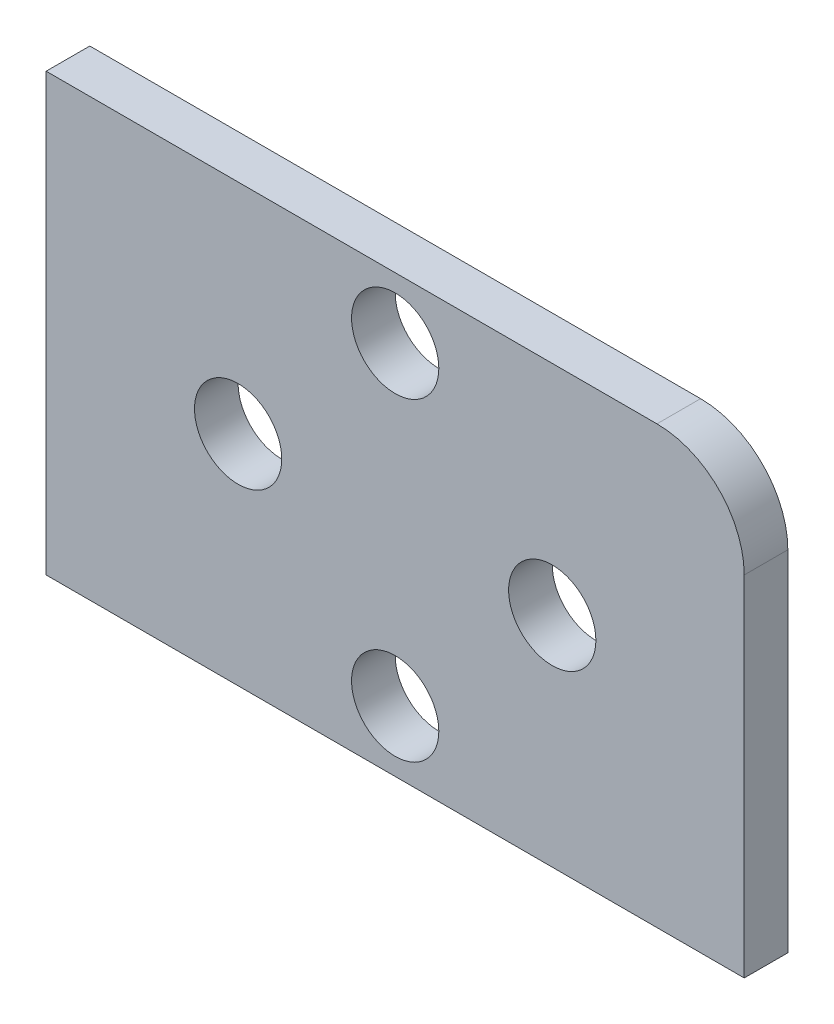
ISO-10303-21;
HEADER;
FILE_DESCRIPTION(('STEP AP214'),'2;1');
FILE_NAME('part.step','',(''),(''),'','','');
FILE_SCHEMA(('AUTOMOTIVE_DESIGN { 1 0 10303 214 1 1 1 1 }'));
ENDSEC;
DATA;
#1=APPLICATION_CONTEXT('core data for automotive mechanical design processes');
#2=APPLICATION_PROTOCOL_DEFINITION('international standard','automotive_design',2000,#1);
#3=PRODUCT_CONTEXT('',#1,'mechanical');
#4=PRODUCT('Part','Part','',(#3));
#5=PRODUCT_RELATED_PRODUCT_CATEGORY('part','',(#4));
#6=PRODUCT_DEFINITION_FORMATION('','',#4);
#7=PRODUCT_DEFINITION_CONTEXT('part definition',#1,'design');
#8=PRODUCT_DEFINITION('design','',#6,#7);
#9=PRODUCT_DEFINITION_SHAPE('','',#8);
#10=(LENGTH_UNIT() NAMED_UNIT(*) SI_UNIT(.MILLI.,.METRE.));
#11=(NAMED_UNIT(*) PLANE_ANGLE_UNIT() SI_UNIT($,.RADIAN.));
#12=(NAMED_UNIT(*) SI_UNIT($,.STERADIAN.) SOLID_ANGLE_UNIT());
#13=UNCERTAINTY_MEASURE_WITH_UNIT(LENGTH_MEASURE(1.E-05),#10,'distance_accuracy_value','');
#14=(GEOMETRIC_REPRESENTATION_CONTEXT(3) GLOBAL_UNCERTAINTY_ASSIGNED_CONTEXT((#13)) GLOBAL_UNIT_ASSIGNED_CONTEXT((#10,
#11,#12)) REPRESENTATION_CONTEXT('',''));
#15=CARTESIAN_POINT('',(0.,0.,0.));
#16=DIRECTION('',(0.,0.,1.));
#17=DIRECTION('',(1.,0.,0.));
#18=AXIS2_PLACEMENT_3D('',#15,#16,#17);
#19=CARTESIAN_POINT('',(30.,15.,-5.));
#20=DIRECTION('',(0.,0.,1.));
#21=DIRECTION('',(1.,0.,0.));
#22=AXIS2_PLACEMENT_3D('',#19,#20,#21);
#23=CYLINDRICAL_SURFACE('',#22,10.);
#24=DIRECTION('',(0.,0.,-1.));
#25=VECTOR('',#24,1.);
#26=CARTESIAN_POINT('',(30.,25.,-5.));
#27=LINE('',#26,#25);
#28=CARTESIAN_POINT('',(30.,25.,0.));
#29=VERTEX_POINT('',#28);
#30=CARTESIAN_POINT('',(30.,25.,-5.));
#31=VERTEX_POINT('',#30);
#32=EDGE_CURVE('E88',#29,#31,#27,.T.);
#33=ORIENTED_EDGE('',*,*,#32,.F.);
#34=CARTESIAN_POINT('',(30.,15.,0.));
#35=DIRECTION('',(0.,0.,1.));
#36=DIRECTION('',(1.,0.,0.));
#37=AXIS2_PLACEMENT_3D('',#34,#35,#36);
#38=CIRCLE('',#37,10.);
#39=CARTESIAN_POINT('',(40.,15.,0.));
#40=VERTEX_POINT('',#39);
#41=EDGE_CURVE('E46',#40,#29,#38,.T.);
#42=ORIENTED_EDGE('',*,*,#41,.F.);
#43=DIRECTION('',(0.,0.,-1.));
#44=VECTOR('',#43,1.);
#45=CARTESIAN_POINT('',(40.,15.,-5.));
#46=LINE('',#45,#44);
#47=CARTESIAN_POINT('',(40.,15.,-5.));
#48=VERTEX_POINT('',#47);
#49=EDGE_CURVE('E135',#48,#40,#46,.F.);
#50=ORIENTED_EDGE('',*,*,#49,.F.);
#51=CARTESIAN_POINT('',(30.,15.,-5.));
#52=DIRECTION('',(0.,0.,1.));
#53=DIRECTION('',(1.,0.,0.));
#54=AXIS2_PLACEMENT_3D('',#51,#52,#53);
#55=CIRCLE('',#54,10.);
#56=EDGE_CURVE('E11',#31,#48,#55,.F.);
#57=ORIENTED_EDGE('',*,*,#56,.F.);
#58=EDGE_LOOP('',(#33,#42,#50,#57));
#59=FACE_BOUND('',#58,.T.);
#60=ADVANCED_FACE('F38',(#59),#23,.T.);
#61=CARTESIAN_POINT('',(40.,25.,-5.));
#62=DIRECTION('',(0.,1.,0.));
#63=DIRECTION('',(-1.,0.,0.));
#64=AXIS2_PLACEMENT_3D('',#61,#62,#63);
#65=PLANE('',#64);
#66=DIRECTION('',(-1.,0.,0.));
#67=VECTOR('',#66,1.);
#68=CARTESIAN_POINT('',(40.,25.,0.));
#69=LINE('',#68,#67);
#70=CARTESIAN_POINT('',(-40.,25.,0.));
#71=VERTEX_POINT('',#70);
#72=EDGE_CURVE('E115',#29,#71,#69,.T.);
#73=ORIENTED_EDGE('',*,*,#72,.F.);
#74=ORIENTED_EDGE('',*,*,#32,.T.);
#75=DIRECTION('',(-1.,0.,0.));
#76=VECTOR('',#75,1.);
#77=CARTESIAN_POINT('',(40.,25.,-5.));
#78=LINE('',#77,#76);
#79=CARTESIAN_POINT('',(-40.,25.,-5.));
#80=VERTEX_POINT('',#79);
#81=EDGE_CURVE('E82',#31,#80,#78,.T.);
#82=ORIENTED_EDGE('',*,*,#81,.T.);
#83=DIRECTION('',(0.,0.,1.));
#84=VECTOR('',#83,1.);
#85=CARTESIAN_POINT('',(-40.,25.,-5.));
#86=LINE('',#85,#84);
#87=EDGE_CURVE('E86',#80,#71,#86,.T.);
#88=ORIENTED_EDGE('',*,*,#87,.T.);
#89=EDGE_LOOP('',(#73,#74,#82,#88));
#90=FACE_BOUND('',#89,.T.);
#91=ADVANCED_FACE('F85',(#90),#65,.T.);
#92=CARTESIAN_POINT('',(40.,25.,-5.));
#93=DIRECTION('',(-1.,0.,0.));
#94=DIRECTION('',(0.,-1.,0.));
#95=AXIS2_PLACEMENT_3D('',#92,#93,#94);
#96=PLANE('',#95);
#97=DIRECTION('',(0.,-1.,0.));
#98=VECTOR('',#97,1.);
#99=CARTESIAN_POINT('',(40.,25.,-5.));
#100=LINE('',#99,#98);
#101=CARTESIAN_POINT('',(40.,-25.,-5.));
#102=VERTEX_POINT('',#101);
#103=EDGE_CURVE('E101',#48,#102,#100,.T.);
#104=ORIENTED_EDGE('',*,*,#103,.F.);
#105=ORIENTED_EDGE('',*,*,#49,.T.);
#106=DIRECTION('',(0.,-1.,0.));
#107=VECTOR('',#106,1.);
#108=CARTESIAN_POINT('',(40.,25.,0.));
#109=LINE('',#108,#107);
#110=CARTESIAN_POINT('',(40.,-25.,0.));
#111=VERTEX_POINT('',#110);
#112=EDGE_CURVE('E92',#40,#111,#109,.T.);
#113=ORIENTED_EDGE('',*,*,#112,.T.);
#114=DIRECTION('',(0.,0.,1.));
#115=VECTOR('',#114,1.);
#116=CARTESIAN_POINT('',(40.,-25.,-5.));
#117=LINE('',#116,#115);
#118=EDGE_CURVE('E127',#102,#111,#117,.T.);
#119=ORIENTED_EDGE('',*,*,#118,.F.);
#120=EDGE_LOOP('',(#104,#105,#113,#119));
#121=FACE_BOUND('',#120,.T.);
#122=ADVANCED_FACE('F145',(#121),#96,.F.);
#123=CARTESIAN_POINT('',(40.,-25.,-5.));
#124=DIRECTION('',(0.,1.,0.));
#125=DIRECTION('',(-1.,0.,0.));
#126=AXIS2_PLACEMENT_3D('',#123,#124,#125);
#127=PLANE('',#126);
#128=DIRECTION('',(-1.,0.,0.));
#129=VECTOR('',#128,1.);
#130=CARTESIAN_POINT('',(40.,-25.,0.));
#131=LINE('',#130,#129);
#132=CARTESIAN_POINT('',(-40.,-25.,0.));
#133=VERTEX_POINT('',#132);
#134=EDGE_CURVE('E121',#111,#133,#131,.T.);
#135=ORIENTED_EDGE('',*,*,#134,.T.);
#136=DIRECTION('',(0.,0.,1.));
#137=VECTOR('',#136,1.);
#138=CARTESIAN_POINT('',(-40.,-25.,-5.));
#139=LINE('',#138,#137);
#140=CARTESIAN_POINT('',(-40.,-25.,-5.));
#141=VERTEX_POINT('',#140);
#142=EDGE_CURVE('E100',#141,#133,#139,.T.);
#143=ORIENTED_EDGE('',*,*,#142,.F.);
#144=DIRECTION('',(-1.,0.,0.));
#145=VECTOR('',#144,1.);
#146=CARTESIAN_POINT('',(40.,-25.,-5.));
#147=LINE('',#146,#145);
#148=EDGE_CURVE('E105',#102,#141,#147,.T.);
#149=ORIENTED_EDGE('',*,*,#148,.F.);
#150=ORIENTED_EDGE('',*,*,#118,.T.);
#151=EDGE_LOOP('',(#135,#143,#149,#150));
#152=FACE_BOUND('',#151,.T.);
#153=ADVANCED_FACE('F147',(#152),#127,.F.);
#154=CARTESIAN_POINT('',(-40.,25.,-5.));
#155=DIRECTION('',(-1.,0.,0.));
#156=DIRECTION('',(0.,-1.,0.));
#157=AXIS2_PLACEMENT_3D('',#154,#155,#156);
#158=PLANE('',#157);
#159=DIRECTION('',(0.,-1.,0.));
#160=VECTOR('',#159,1.);
#161=CARTESIAN_POINT('',(-40.,25.,0.));
#162=LINE('',#161,#160);
#163=EDGE_CURVE('E98',#71,#133,#162,.T.);
#164=ORIENTED_EDGE('',*,*,#163,.F.);
#165=ORIENTED_EDGE('',*,*,#87,.F.);
#166=DIRECTION('',(0.,-1.,0.));
#167=VECTOR('',#166,1.);
#168=CARTESIAN_POINT('',(-40.,25.,-5.));
#169=LINE('',#168,#167);
#170=EDGE_CURVE('E91',#80,#141,#169,.T.);
#171=ORIENTED_EDGE('',*,*,#170,.T.);
#172=ORIENTED_EDGE('',*,*,#142,.T.);
#173=EDGE_LOOP('',(#164,#165,#171,#172));
#174=FACE_BOUND('',#173,.T.);
#175=ADVANCED_FACE('F96',(#174),#158,.T.);
#176=CARTESIAN_POINT('',(0.,0.,-5.));
#177=DIRECTION('',(0.,0.,1.));
#178=DIRECTION('',(1.,0.,0.));
#179=AXIS2_PLACEMENT_3D('',#176,#177,#178);
#180=PLANE('',#179);
#181=CARTESIAN_POINT('',(-18.,0.,-5.));
#182=DIRECTION('',(0.,0.,1.));
#183=DIRECTION('',(1.,0.,0.));
#184=AXIS2_PLACEMENT_3D('',#181,#182,#183);
#185=CIRCLE('',#184,5.);
#186=CARTESIAN_POINT('',(-13.,0.,-5.));
#187=VERTEX_POINT('',#186);
#188=EDGE_CURVE('E118',#187,#187,#185,.T.);
#189=ORIENTED_EDGE('',*,*,#188,.T.);
#190=EDGE_LOOP('',(#189));
#191=FACE_BOUND('',#190,.T.);
#192=CARTESIAN_POINT('',(0.,18.,-5.));
#193=DIRECTION('',(0.,0.,1.));
#194=DIRECTION('',(1.,0.,0.));
#195=AXIS2_PLACEMENT_3D('',#192,#193,#194);
#196=CIRCLE('',#195,5.);
#197=CARTESIAN_POINT('',(5.00000000000006,18.,-5.));
#198=VERTEX_POINT('',#197);
#199=EDGE_CURVE('E236',#198,#198,#196,.T.);
#200=ORIENTED_EDGE('',*,*,#199,.T.);
#201=EDGE_LOOP('',(#200));
#202=FACE_BOUND('',#201,.T.);
#203=CARTESIAN_POINT('',(18.,-1.23488963959888E-13,-5.));
#204=DIRECTION('',(0.,0.,1.));
#205=DIRECTION('',(1.,0.,0.));
#206=AXIS2_PLACEMENT_3D('',#203,#204,#205);
#207=CIRCLE('',#206,5.);
#208=CARTESIAN_POINT('',(23.,-1.23488963959888E-13,-5.));
#209=VERTEX_POINT('',#208);
#210=EDGE_CURVE('E248',#209,#209,#207,.T.);
#211=ORIENTED_EDGE('',*,*,#210,.T.);
#212=EDGE_LOOP('',(#211));
#213=FACE_BOUND('',#212,.T.);
#214=CARTESIAN_POINT('',(-1.89805075011018E-13,-18.,-5.));
#215=DIRECTION('',(0.,0.,1.));
#216=DIRECTION('',(1.,0.,0.));
#217=AXIS2_PLACEMENT_3D('',#214,#215,#216);
#218=CIRCLE('',#217,5.);
#219=CARTESIAN_POINT('',(4.99999999999981,-18.,-5.));
#220=VERTEX_POINT('',#219);
#221=EDGE_CURVE('E256',#220,#220,#218,.T.);
#222=ORIENTED_EDGE('',*,*,#221,.T.);
#223=EDGE_LOOP('',(#222));
#224=FACE_BOUND('',#223,.T.);
#225=ORIENTED_EDGE('',*,*,#81,.F.);
#226=ORIENTED_EDGE('',*,*,#56,.T.);
#227=ORIENTED_EDGE('',*,*,#103,.T.);
#228=ORIENTED_EDGE('',*,*,#148,.T.);
#229=ORIENTED_EDGE('',*,*,#170,.F.);
#230=EDGE_LOOP('',(#225,#226,#227,#228,#229));
#231=FACE_BOUND('',#230,.T.);
#232=ADVANCED_FACE('F103',(#191,#202,#213,#224,#231),#180,.F.);
#233=CARTESIAN_POINT('',(0.,0.,0.));
#234=DIRECTION('',(0.,0.,1.));
#235=DIRECTION('',(1.,0.,0.));
#236=AXIS2_PLACEMENT_3D('',#233,#234,#235);
#237=PLANE('',#236);
#238=CARTESIAN_POINT('',(-18.,0.,0.));
#239=DIRECTION('',(0.,0.,1.));
#240=DIRECTION('',(1.,0.,0.));
#241=AXIS2_PLACEMENT_3D('',#238,#239,#240);
#242=CIRCLE('',#241,5.);
#243=CARTESIAN_POINT('',(-13.,0.,0.));
#244=VERTEX_POINT('',#243);
#245=EDGE_CURVE('E234',#244,#244,#242,.T.);
#246=ORIENTED_EDGE('',*,*,#245,.F.);
#247=EDGE_LOOP('',(#246));
#248=FACE_BOUND('',#247,.T.);
#249=CARTESIAN_POINT('',(0.,18.,0.));
#250=DIRECTION('',(0.,0.,1.));
#251=DIRECTION('',(1.,0.,0.));
#252=AXIS2_PLACEMENT_3D('',#249,#250,#251);
#253=CIRCLE('',#252,5.);
#254=CARTESIAN_POINT('',(5.00000000000006,18.,0.));
#255=VERTEX_POINT('',#254);
#256=EDGE_CURVE('E242',#255,#255,#253,.T.);
#257=ORIENTED_EDGE('',*,*,#256,.F.);
#258=EDGE_LOOP('',(#257));
#259=FACE_BOUND('',#258,.T.);
#260=CARTESIAN_POINT('',(18.,-1.23488963959888E-13,0.));
#261=DIRECTION('',(0.,0.,1.));
#262=DIRECTION('',(1.,0.,0.));
#263=AXIS2_PLACEMENT_3D('',#260,#261,#262);
#264=CIRCLE('',#263,5.);
#265=CARTESIAN_POINT('',(23.,-1.23488963959888E-13,0.));
#266=VERTEX_POINT('',#265);
#267=EDGE_CURVE('E252',#266,#266,#264,.T.);
#268=ORIENTED_EDGE('',*,*,#267,.F.);
#269=EDGE_LOOP('',(#268));
#270=FACE_BOUND('',#269,.T.);
#271=CARTESIAN_POINT('',(-1.89805075011018E-13,-18.,0.));
#272=DIRECTION('',(0.,0.,1.));
#273=DIRECTION('',(1.,0.,0.));
#274=AXIS2_PLACEMENT_3D('',#271,#272,#273);
#275=CIRCLE('',#274,5.);
#276=CARTESIAN_POINT('',(4.99999999999981,-18.,0.));
#277=VERTEX_POINT('',#276);
#278=EDGE_CURVE('E259',#277,#277,#275,.T.);
#279=ORIENTED_EDGE('',*,*,#278,.F.);
#280=EDGE_LOOP('',(#279));
#281=FACE_BOUND('',#280,.T.);
#282=ORIENTED_EDGE('',*,*,#112,.F.);
#283=ORIENTED_EDGE('',*,*,#41,.T.);
#284=ORIENTED_EDGE('',*,*,#72,.T.);
#285=ORIENTED_EDGE('',*,*,#163,.T.);
#286=ORIENTED_EDGE('',*,*,#134,.F.);
#287=EDGE_LOOP('',(#282,#283,#284,#285,#286));
#288=FACE_BOUND('',#287,.T.);
#289=ADVANCED_FACE('F140',(#248,#259,#270,#281,#288),#237,.T.);
#290=CARTESIAN_POINT('',(-1.89805075011018E-13,-18.,-5.));
#291=DIRECTION('',(0.,0.,1.));
#292=DIRECTION('',(1.,0.,0.));
#293=AXIS2_PLACEMENT_3D('',#290,#291,#292);
#294=CYLINDRICAL_SURFACE('',#293,5.);
#295=ORIENTED_EDGE('',*,*,#221,.F.);
#296=EDGE_LOOP('',(#295));
#297=FACE_BOUND('',#296,.T.);
#298=ORIENTED_EDGE('',*,*,#278,.T.);
#299=EDGE_LOOP('',(#298));
#300=FACE_BOUND('',#299,.T.);
#301=ADVANCED_FACE('F182',(#297,#300),#294,.F.);
#302=CARTESIAN_POINT('',(18.,-1.23488963959888E-13,-5.));
#303=DIRECTION('',(0.,0.,1.));
#304=DIRECTION('',(1.,0.,0.));
#305=AXIS2_PLACEMENT_3D('',#302,#303,#304);
#306=CYLINDRICAL_SURFACE('',#305,5.);
#307=ORIENTED_EDGE('',*,*,#210,.F.);
#308=EDGE_LOOP('',(#307));
#309=FACE_BOUND('',#308,.T.);
#310=ORIENTED_EDGE('',*,*,#267,.T.);
#311=EDGE_LOOP('',(#310));
#312=FACE_BOUND('',#311,.T.);
#313=ADVANCED_FACE('F194',(#309,#312),#306,.F.);
#314=CARTESIAN_POINT('',(0.,18.,-5.));
#315=DIRECTION('',(0.,0.,1.));
#316=DIRECTION('',(1.,0.,0.));
#317=AXIS2_PLACEMENT_3D('',#314,#315,#316);
#318=CYLINDRICAL_SURFACE('',#317,5.);
#319=ORIENTED_EDGE('',*,*,#199,.F.);
#320=EDGE_LOOP('',(#319));
#321=FACE_BOUND('',#320,.T.);
#322=ORIENTED_EDGE('',*,*,#256,.T.);
#323=EDGE_LOOP('',(#322));
#324=FACE_BOUND('',#323,.T.);
#325=ADVANCED_FACE('F202',(#321,#324),#318,.F.);
#326=CARTESIAN_POINT('',(-18.,0.,-5.));
#327=DIRECTION('',(0.,0.,1.));
#328=DIRECTION('',(1.,0.,0.));
#329=AXIS2_PLACEMENT_3D('',#326,#327,#328);
#330=CYLINDRICAL_SURFACE('',#329,5.);
#331=ORIENTED_EDGE('',*,*,#188,.F.);
#332=EDGE_LOOP('',(#331));
#333=FACE_BOUND('',#332,.T.);
#334=ORIENTED_EDGE('',*,*,#245,.T.);
#335=EDGE_LOOP('',(#334));
#336=FACE_BOUND('',#335,.T.);
#337=ADVANCED_FACE('F209',(#333,#336),#330,.F.);
#338=CLOSED_SHELL('',(#60,#91,#122,#153,#175,#232,#289,#301,#313,#325,#337));
#339=MANIFOLD_SOLID_BREP('B2',#338);
#340=ADVANCED_BREP_SHAPE_REPRESENTATION('',(#18,#339),#14);
#341=SHAPE_DEFINITION_REPRESENTATION(#9,#340);
ENDSEC;
END-ISO-10303-21;
